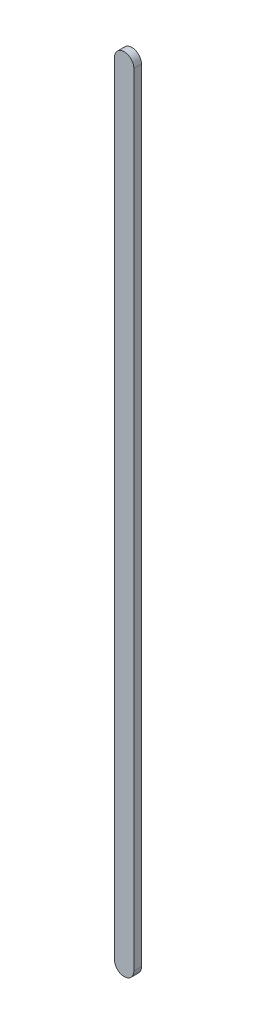
ISO-10303-21;
HEADER;
FILE_DESCRIPTION(('STEP AP214'),'2;1');
FILE_NAME('part.step','',(''),(''),'','','');
FILE_SCHEMA(('AUTOMOTIVE_DESIGN { 1 0 10303 214 1 1 1 1 }'));
ENDSEC;
DATA;
#1=APPLICATION_CONTEXT('core data for automotive mechanical design processes');
#2=APPLICATION_PROTOCOL_DEFINITION('international standard','automotive_design',2000,#1);
#3=PRODUCT_CONTEXT('',#1,'mechanical');
#4=PRODUCT('Part','Part','',(#3));
#5=PRODUCT_RELATED_PRODUCT_CATEGORY('part','',(#4));
#6=PRODUCT_DEFINITION_FORMATION('','',#4);
#7=PRODUCT_DEFINITION_CONTEXT('part definition',#1,'design');
#8=PRODUCT_DEFINITION('design','',#6,#7);
#9=PRODUCT_DEFINITION_SHAPE('','',#8);
#10=(LENGTH_UNIT() NAMED_UNIT(*) SI_UNIT(.MILLI.,.METRE.));
#11=(NAMED_UNIT(*) PLANE_ANGLE_UNIT() SI_UNIT($,.RADIAN.));
#12=(NAMED_UNIT(*) SI_UNIT($,.STERADIAN.) SOLID_ANGLE_UNIT());
#13=UNCERTAINTY_MEASURE_WITH_UNIT(LENGTH_MEASURE(1.E-05),#10,'distance_accuracy_value','');
#14=(GEOMETRIC_REPRESENTATION_CONTEXT(3) GLOBAL_UNCERTAINTY_ASSIGNED_CONTEXT((#13)) GLOBAL_UNIT_ASSIGNED_CONTEXT((#10,
#11,#12)) REPRESENTATION_CONTEXT('',''));
#15=CARTESIAN_POINT('',(0.,0.,0.));
#16=DIRECTION('',(0.,0.,1.));
#17=DIRECTION('',(1.,0.,0.));
#18=AXIS2_PLACEMENT_3D('',#15,#16,#17);
#19=CARTESIAN_POINT('',(154.686,98.298,0.));
#20=DIRECTION('',(-1.,0.,0.));
#21=DIRECTION('',(0.,1.,0.));
#22=AXIS2_PLACEMENT_3D('',#19,#20,#21);
#23=PLANE('',#22);
#24=DIRECTION('',(0.,1.,0.));
#25=VECTOR('',#24,1.);
#26=CARTESIAN_POINT('',(154.686,98.298,0.1999996));
#27=LINE('',#26,#25);
#28=CARTESIAN_POINT('',(154.686,98.298,0.1999996));
#29=VERTEX_POINT('',#28);
#30=CARTESIAN_POINT('',(154.686,118.872,0.1999996));
#31=VERTEX_POINT('',#30);
#32=EDGE_CURVE('E11',#29,#31,#27,.T.);
#33=ORIENTED_EDGE('',*,*,#32,.F.);
#34=DIRECTION('',(0.,0.,1.));
#35=VECTOR('',#34,1.);
#36=CARTESIAN_POINT('',(154.686,98.298,0.));
#37=LINE('',#36,#35);
#38=CARTESIAN_POINT('',(154.686,98.298,0.));
#39=VERTEX_POINT('',#38);
#40=EDGE_CURVE('E24',#39,#29,#37,.T.);
#41=ORIENTED_EDGE('',*,*,#40,.F.);
#42=DIRECTION('',(0.,1.,0.));
#43=VECTOR('',#42,1.);
#44=CARTESIAN_POINT('',(154.686,98.298,0.));
#45=LINE('',#44,#43);
#46=CARTESIAN_POINT('',(154.686,118.872,0.));
#47=VERTEX_POINT('',#46);
#48=EDGE_CURVE('E75',#39,#47,#45,.T.);
#49=ORIENTED_EDGE('',*,*,#48,.T.);
#50=DIRECTION('',(0.,0.,1.));
#51=VECTOR('',#50,1.);
#52=CARTESIAN_POINT('',(154.686,118.872,0.));
#53=LINE('',#52,#51);
#54=EDGE_CURVE('E37',#47,#31,#53,.T.);
#55=ORIENTED_EDGE('',*,*,#54,.T.);
#56=EDGE_LOOP('',(#33,#41,#49,#55));
#57=FACE_BOUND('',#56,.T.);
#58=ADVANCED_FACE('F17',(#57),#23,.F.);
#59=CARTESIAN_POINT('',(154.432,118.872,0.));
#60=DIRECTION('',(0.,0.,-1.));
#61=DIRECTION('',(1.,0.,0.));
#62=AXIS2_PLACEMENT_3D('',#59,#60,#61);
#63=CYLINDRICAL_SURFACE('',#62,0.254000000000005);
#64=CARTESIAN_POINT('',(154.432,118.872,0.1999996));
#65=DIRECTION('',(0.,0.,1.));
#66=DIRECTION('',(1.,0.,0.));
#67=AXIS2_PLACEMENT_3D('',#64,#65,#66);
#68=CIRCLE('',#67,0.254000000000005);
#69=CARTESIAN_POINT('',(154.178,118.872,0.1999996));
#70=VERTEX_POINT('',#69);
#71=EDGE_CURVE('E83',#31,#70,#68,.T.);
#72=ORIENTED_EDGE('',*,*,#71,.F.);
#73=ORIENTED_EDGE('',*,*,#54,.F.);
#74=CARTESIAN_POINT('',(154.432,118.872,0.));
#75=DIRECTION('',(0.,0.,1.));
#76=DIRECTION('',(1.,0.,0.));
#77=AXIS2_PLACEMENT_3D('',#74,#75,#76);
#78=CIRCLE('',#77,0.254000000000005);
#79=CARTESIAN_POINT('',(154.178,118.872,0.));
#80=VERTEX_POINT('',#79);
#81=EDGE_CURVE('E81',#47,#80,#78,.T.);
#82=ORIENTED_EDGE('',*,*,#81,.T.);
#83=DIRECTION('',(0.,0.,1.));
#84=VECTOR('',#83,1.);
#85=CARTESIAN_POINT('',(154.178,118.872,0.));
#86=LINE('',#85,#84);
#87=EDGE_CURVE('E67',#80,#70,#86,.T.);
#88=ORIENTED_EDGE('',*,*,#87,.T.);
#89=EDGE_LOOP('',(#72,#73,#82,#88));
#90=FACE_BOUND('',#89,.T.);
#91=ADVANCED_FACE('F89',(#90),#63,.T.);
#92=CARTESIAN_POINT('',(154.178,118.872,0.));
#93=DIRECTION('',(1.,0.,0.));
#94=DIRECTION('',(0.,-1.,0.));
#95=AXIS2_PLACEMENT_3D('',#92,#93,#94);
#96=PLANE('',#95);
#97=DIRECTION('',(0.,-1.,0.));
#98=VECTOR('',#97,1.);
#99=CARTESIAN_POINT('',(154.178,118.872,0.1999996));
#100=LINE('',#99,#98);
#101=CARTESIAN_POINT('',(154.178,98.298,0.1999996));
#102=VERTEX_POINT('',#101);
#103=EDGE_CURVE('E71',#70,#102,#100,.T.);
#104=ORIENTED_EDGE('',*,*,#103,.F.);
#105=ORIENTED_EDGE('',*,*,#87,.F.);
#106=DIRECTION('',(0.,-1.,0.));
#107=VECTOR('',#106,1.);
#108=CARTESIAN_POINT('',(154.178,118.872,0.));
#109=LINE('',#108,#107);
#110=CARTESIAN_POINT('',(154.178,98.298,0.));
#111=VERTEX_POINT('',#110);
#112=EDGE_CURVE('E63',#80,#111,#109,.T.);
#113=ORIENTED_EDGE('',*,*,#112,.T.);
#114=DIRECTION('',(0.,0.,1.));
#115=VECTOR('',#114,1.);
#116=CARTESIAN_POINT('',(154.178,98.298,0.));
#117=LINE('',#116,#115);
#118=EDGE_CURVE('E53',#111,#102,#117,.T.);
#119=ORIENTED_EDGE('',*,*,#118,.T.);
#120=EDGE_LOOP('',(#104,#105,#113,#119));
#121=FACE_BOUND('',#120,.T.);
#122=ADVANCED_FACE('F66',(#121),#96,.F.);
#123=CARTESIAN_POINT('',(154.432,98.298,0.));
#124=DIRECTION('',(0.,0.,-1.));
#125=DIRECTION('',(-1.,0.,0.));
#126=AXIS2_PLACEMENT_3D('',#123,#124,#125);
#127=CYLINDRICAL_SURFACE('',#126,0.254);
#128=CARTESIAN_POINT('',(154.432,98.298,0.1999996));
#129=DIRECTION('',(0.,0.,1.));
#130=DIRECTION('',(-1.,0.,0.));
#131=AXIS2_PLACEMENT_3D('',#128,#129,#130);
#132=CIRCLE('',#131,0.254);
#133=EDGE_CURVE('E59',#102,#29,#132,.T.);
#134=ORIENTED_EDGE('',*,*,#133,.F.);
#135=ORIENTED_EDGE('',*,*,#118,.F.);
#136=CARTESIAN_POINT('',(154.432,98.298,0.));
#137=DIRECTION('',(0.,0.,1.));
#138=DIRECTION('',(-1.,0.,0.));
#139=AXIS2_PLACEMENT_3D('',#136,#137,#138);
#140=CIRCLE('',#139,0.254);
#141=EDGE_CURVE('E57',#111,#39,#140,.T.);
#142=ORIENTED_EDGE('',*,*,#141,.T.);
#143=ORIENTED_EDGE('',*,*,#40,.T.);
#144=EDGE_LOOP('',(#134,#135,#142,#143));
#145=FACE_BOUND('',#144,.T.);
#146=ADVANCED_FACE('F55',(#145),#127,.T.);
#147=CARTESIAN_POINT('',(154.686,98.298,0.));
#148=DIRECTION('',(0.,0.,-1.));
#149=DIRECTION('',(-1.,0.,0.));
#150=AXIS2_PLACEMENT_3D('',#147,#148,#149);
#151=PLANE('',#150);
#152=ORIENTED_EDGE('',*,*,#141,.F.);
#153=ORIENTED_EDGE('',*,*,#112,.F.);
#154=ORIENTED_EDGE('',*,*,#81,.F.);
#155=ORIENTED_EDGE('',*,*,#48,.F.);
#156=EDGE_LOOP('',(#152,#153,#154,#155));
#157=FACE_BOUND('',#156,.T.);
#158=ADVANCED_FACE('F74',(#157),#151,.T.);
#159=CARTESIAN_POINT('',(154.686,98.298,0.1999996));
#160=DIRECTION('',(0.,0.,-1.));
#161=DIRECTION('',(-1.,0.,0.));
#162=AXIS2_PLACEMENT_3D('',#159,#160,#161);
#163=PLANE('',#162);
#164=ORIENTED_EDGE('',*,*,#32,.T.);
#165=ORIENTED_EDGE('',*,*,#71,.T.);
#166=ORIENTED_EDGE('',*,*,#103,.T.);
#167=ORIENTED_EDGE('',*,*,#133,.T.);
#168=EDGE_LOOP('',(#164,#165,#166,#167));
#169=FACE_BOUND('',#168,.T.);
#170=ADVANCED_FACE('F91',(#169),#163,.F.);
#171=CLOSED_SHELL('',(#58,#91,#122,#146,#158,#170));
#172=MANIFOLD_SOLID_BREP('B1',#171);
#173=ADVANCED_BREP_SHAPE_REPRESENTATION('',(#18,#172),#14);
#174=SHAPE_DEFINITION_REPRESENTATION(#9,#173);
ENDSEC;
END-ISO-10303-21;
